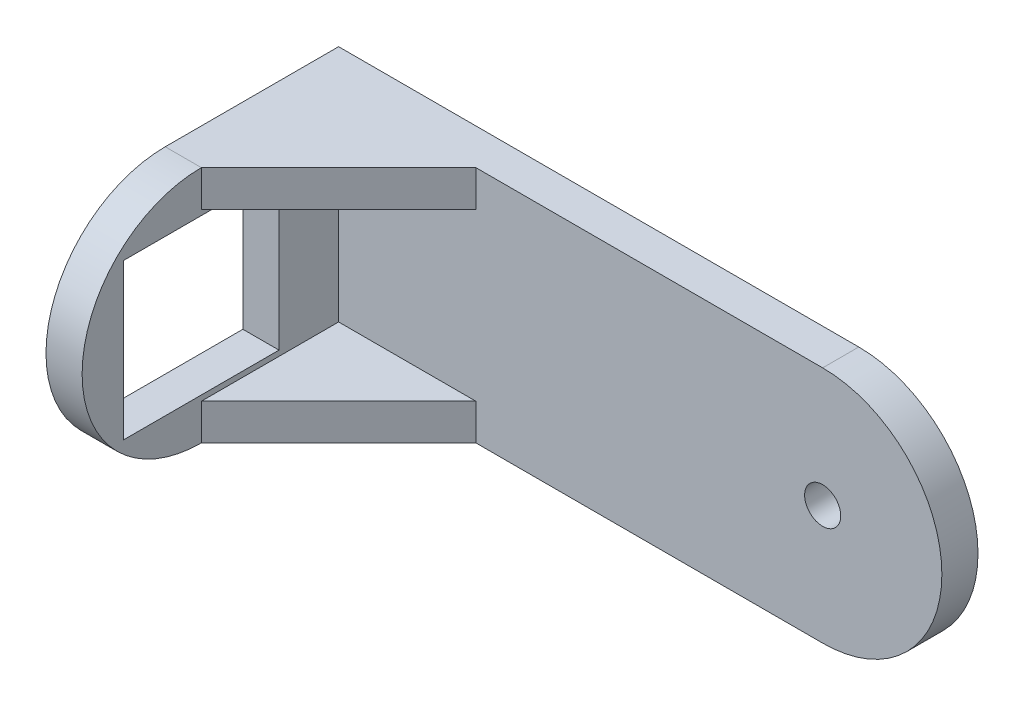
ISO-10303-21;
HEADER;
FILE_DESCRIPTION(('STEP AP214'),'2;1');
FILE_NAME('part.step','',(''),(''),'','','');
FILE_SCHEMA(('AUTOMOTIVE_DESIGN { 1 0 10303 214 1 1 1 1 }'));
ENDSEC;
DATA;
#1=APPLICATION_CONTEXT('core data for automotive mechanical design processes');
#2=APPLICATION_PROTOCOL_DEFINITION('international standard','automotive_design',2000,#1);
#3=PRODUCT_CONTEXT('',#1,'mechanical');
#4=PRODUCT('Part','Part','',(#3));
#5=PRODUCT_RELATED_PRODUCT_CATEGORY('part','',(#4));
#6=PRODUCT_DEFINITION_FORMATION('','',#4);
#7=PRODUCT_DEFINITION_CONTEXT('part definition',#1,'design');
#8=PRODUCT_DEFINITION('design','',#6,#7);
#9=PRODUCT_DEFINITION_SHAPE('','',#8);
#10=(LENGTH_UNIT() NAMED_UNIT(*) SI_UNIT(.MILLI.,.METRE.));
#11=(NAMED_UNIT(*) PLANE_ANGLE_UNIT() SI_UNIT($,.RADIAN.));
#12=(NAMED_UNIT(*) SI_UNIT($,.STERADIAN.) SOLID_ANGLE_UNIT());
#13=UNCERTAINTY_MEASURE_WITH_UNIT(LENGTH_MEASURE(1.E-05),#10,'distance_accuracy_value','');
#14=(GEOMETRIC_REPRESENTATION_CONTEXT(3) GLOBAL_UNCERTAINTY_ASSIGNED_CONTEXT((#13)) GLOBAL_UNIT_ASSIGNED_CONTEXT((#10,
#11,#12)) REPRESENTATION_CONTEXT('',''));
#15=CARTESIAN_POINT('',(0.,0.,0.));
#16=DIRECTION('',(0.,0.,1.));
#17=DIRECTION('',(1.,0.,0.));
#18=AXIS2_PLACEMENT_3D('',#15,#16,#17);
#19=CARTESIAN_POINT('',(0.,0.,10.));
#20=DIRECTION('',(0.,0.,-1.));
#21=DIRECTION('',(-1.,0.,0.));
#22=AXIS2_PLACEMENT_3D('',#19,#20,#21);
#23=PLANE('',#22);
#24=CARTESIAN_POINT('',(0.,0.,10.));
#25=DIRECTION('',(0.,0.,1.));
#26=DIRECTION('',(1.,0.,0.));
#27=AXIS2_PLACEMENT_3D('',#24,#25,#26);
#28=CIRCLE('',#27,5.);
#29=CARTESIAN_POINT('',(5.,0.,10.));
#30=VERTEX_POINT('',#29);
#31=EDGE_CURVE('E228',#30,#30,#28,.T.);
#32=ORIENTED_EDGE('',*,*,#31,.F.);
#33=EDGE_LOOP('',(#32));
#34=FACE_BOUND('',#33,.T.);
#35=DIRECTION('',(0.,-1.,0.));
#36=VECTOR('',#35,1.);
#37=CARTESIAN_POINT('',(-95.9999999999996,-23.,10.));
#38=LINE('',#37,#36);
#39=CARTESIAN_POINT('',(-95.9999999999996,-23.,10.));
#40=VERTEX_POINT('',#39);
#41=CARTESIAN_POINT('',(-95.9999999999996,-33.,10.));
#42=VERTEX_POINT('',#41);
#43=EDGE_CURVE('E284',#40,#42,#38,.T.);
#44=ORIENTED_EDGE('',*,*,#43,.T.);
#45=DIRECTION('',(1.,0.,0.));
#46=VECTOR('',#45,1.);
#47=CARTESIAN_POINT('',(-144.,-33.,10.));
#48=LINE('',#47,#46);
#49=CARTESIAN_POINT('',(0.,-33.,10.));
#50=VERTEX_POINT('',#49);
#51=EDGE_CURVE('E242',#42,#50,#48,.T.);
#52=ORIENTED_EDGE('',*,*,#51,.T.);
#53=CARTESIAN_POINT('',(0.,0.,10.));
#54=DIRECTION('',(0.,0.,1.));
#55=DIRECTION('',(-1.,0.,0.));
#56=AXIS2_PLACEMENT_3D('',#53,#54,#55);
#57=CIRCLE('',#56,33.);
#58=CARTESIAN_POINT('',(0.,33.,10.));
#59=VERTEX_POINT('',#58);
#60=EDGE_CURVE('E236',#50,#59,#57,.T.);
#61=ORIENTED_EDGE('',*,*,#60,.T.);
#62=DIRECTION('',(-1.,0.,0.));
#63=VECTOR('',#62,1.);
#64=CARTESIAN_POINT('',(0.,33.,10.));
#65=LINE('',#64,#63);
#66=CARTESIAN_POINT('',(-95.9999999999996,33.,10.));
#67=VERTEX_POINT('',#66);
#68=EDGE_CURVE('E68',#59,#67,#65,.T.);
#69=ORIENTED_EDGE('',*,*,#68,.T.);
#70=DIRECTION('',(0.,1.,0.));
#71=VECTOR('',#70,1.);
#72=CARTESIAN_POINT('',(-95.9999999999996,23.,10.));
#73=LINE('',#72,#71);
#74=CARTESIAN_POINT('',(-95.9999999999996,23.,10.));
#75=VERTEX_POINT('',#74);
#76=EDGE_CURVE('E63',#75,#67,#73,.T.);
#77=ORIENTED_EDGE('',*,*,#76,.F.);
#78=DIRECTION('',(-1.,0.,0.));
#79=VECTOR('',#78,1.);
#80=CARTESIAN_POINT('',(-134.,23.,10.));
#81=LINE('',#80,#79);
#82=CARTESIAN_POINT('',(-134.,23.,10.));
#83=VERTEX_POINT('',#82);
#84=EDGE_CURVE('E162',#75,#83,#81,.T.);
#85=ORIENTED_EDGE('',*,*,#84,.T.);
#86=DIRECTION('',(0.,1.,0.));
#87=VECTOR('',#86,1.);
#88=CARTESIAN_POINT('',(-134.,0.,10.));
#89=LINE('',#88,#87);
#90=CARTESIAN_POINT('',(-134.,-23.,10.));
#91=VERTEX_POINT('',#90);
#92=EDGE_CURVE('E155',#91,#83,#89,.T.);
#93=ORIENTED_EDGE('',*,*,#92,.F.);
#94=DIRECTION('',(-1.,0.,0.));
#95=VECTOR('',#94,1.);
#96=CARTESIAN_POINT('',(-134.,-23.,10.));
#97=LINE('',#96,#95);
#98=EDGE_CURVE('E142',#40,#91,#97,.T.);
#99=ORIENTED_EDGE('',*,*,#98,.F.);
#100=EDGE_LOOP('',(#44,#52,#61,#69,#77,#85,#93,#99));
#101=FACE_BOUND('',#100,.T.);
#102=ADVANCED_FACE('F47',(#34,#101),#23,.F.);
#103=CARTESIAN_POINT('',(-134.,0.,0.));
#104=DIRECTION('',(-1.,0.,0.));
#105=DIRECTION('',(0.,0.,1.));
#106=AXIS2_PLACEMENT_3D('',#103,#104,#105);
#107=PLANE('',#106);
#108=DIRECTION('',(0.,0.,1.));
#109=VECTOR('',#108,1.);
#110=CARTESIAN_POINT('',(-134.,21.5,0.));
#111=LINE('',#110,#109);
#112=CARTESIAN_POINT('',(-134.,21.5,26.5));
#113=VERTEX_POINT('',#112);
#114=CARTESIAN_POINT('',(-134.,21.5,69.5));
#115=VERTEX_POINT('',#114);
#116=EDGE_CURVE('E165',#113,#115,#111,.T.);
#117=ORIENTED_EDGE('',*,*,#116,.F.);
#118=DIRECTION('',(0.,-1.,0.));
#119=VECTOR('',#118,1.);
#120=CARTESIAN_POINT('',(-134.,0.,26.5));
#121=LINE('',#120,#119);
#122=CARTESIAN_POINT('',(-134.,-21.5,26.5));
#123=VERTEX_POINT('',#122);
#124=EDGE_CURVE('E183',#113,#123,#121,.T.);
#125=ORIENTED_EDGE('',*,*,#124,.T.);
#126=DIRECTION('',(0.,0.,1.));
#127=VECTOR('',#126,1.);
#128=CARTESIAN_POINT('',(-134.,-21.5,0.));
#129=LINE('',#128,#127);
#130=CARTESIAN_POINT('',(-134.,-21.5,69.5));
#131=VERTEX_POINT('',#130);
#132=EDGE_CURVE('E180',#123,#131,#129,.T.);
#133=ORIENTED_EDGE('',*,*,#132,.T.);
#134=DIRECTION('',(0.,-1.,0.));
#135=VECTOR('',#134,1.);
#136=CARTESIAN_POINT('',(-134.,0.,69.5));
#137=LINE('',#136,#135);
#138=EDGE_CURVE('E171',#115,#131,#137,.T.);
#139=ORIENTED_EDGE('',*,*,#138,.F.);
#140=EDGE_LOOP('',(#117,#125,#133,#139));
#141=FACE_BOUND('',#140,.T.);
#142=DIRECTION('',(0.,-1.,0.));
#143=VECTOR('',#142,1.);
#144=CARTESIAN_POINT('',(-134.,-23.,48.));
#145=LINE('',#144,#143);
#146=CARTESIAN_POINT('',(-134.,-23.,48.));
#147=VERTEX_POINT('',#146);
#148=CARTESIAN_POINT('',(-134.,-33.,48.));
#149=VERTEX_POINT('',#148);
#150=EDGE_CURVE('E157',#147,#149,#145,.T.);
#151=ORIENTED_EDGE('',*,*,#150,.F.);
#152=DIRECTION('',(0.,0.,1.));
#153=VECTOR('',#152,1.);
#154=CARTESIAN_POINT('',(-134.,-23.,48.));
#155=LINE('',#154,#153);
#156=EDGE_CURVE('E145',#91,#147,#155,.T.);
#157=ORIENTED_EDGE('',*,*,#156,.F.);
#158=ORIENTED_EDGE('',*,*,#92,.T.);
#159=DIRECTION('',(0.,0.,1.));
#160=VECTOR('',#159,1.);
#161=CARTESIAN_POINT('',(-134.,23.,48.));
#162=LINE('',#161,#160);
#163=CARTESIAN_POINT('',(-134.,23.,48.));
#164=VERTEX_POINT('',#163);
#165=EDGE_CURVE('E301',#83,#164,#162,.T.);
#166=ORIENTED_EDGE('',*,*,#165,.T.);
#167=DIRECTION('',(0.,1.,0.));
#168=VECTOR('',#167,1.);
#169=CARTESIAN_POINT('',(-134.,23.,48.));
#170=LINE('',#169,#168);
#171=CARTESIAN_POINT('',(-134.,33.,48.));
#172=VERTEX_POINT('',#171);
#173=EDGE_CURVE('E292',#164,#172,#170,.T.);
#174=ORIENTED_EDGE('',*,*,#173,.T.);
#175=CARTESIAN_POINT('',(-134.,0.,48.));
#176=DIRECTION('',(-1.,0.,0.));
#177=DIRECTION('',(0.,0.,1.));
#178=AXIS2_PLACEMENT_3D('',#175,#176,#177);
#179=CIRCLE('',#178,33.);
#180=EDGE_CURVE('E166',#172,#149,#179,.F.);
#181=ORIENTED_EDGE('',*,*,#180,.T.);
#182=EDGE_LOOP('',(#151,#157,#158,#166,#174,#181));
#183=FACE_BOUND('',#182,.T.);
#184=ADVANCED_FACE('F154',(#141,#183),#107,.F.);
#185=CARTESIAN_POINT('',(0.,0.,0.));
#186=DIRECTION('',(0.,0.,-1.));
#187=DIRECTION('',(-1.,0.,0.));
#188=AXIS2_PLACEMENT_3D('',#185,#186,#187);
#189=PLANE('',#188);
#190=CARTESIAN_POINT('',(0.,0.,0.));
#191=DIRECTION('',(0.,0.,1.));
#192=DIRECTION('',(-1.,0.,0.));
#193=AXIS2_PLACEMENT_3D('',#190,#191,#192);
#194=CIRCLE('',#193,33.);
#195=CARTESIAN_POINT('',(0.,-33.,0.));
#196=VERTEX_POINT('',#195);
#197=CARTESIAN_POINT('',(0.,33.,0.));
#198=VERTEX_POINT('',#197);
#199=EDGE_CURVE('E232',#196,#198,#194,.T.);
#200=ORIENTED_EDGE('',*,*,#199,.F.);
#201=DIRECTION('',(1.,0.,0.));
#202=VECTOR('',#201,1.);
#203=CARTESIAN_POINT('',(-144.,-33.,0.));
#204=LINE('',#203,#202);
#205=CARTESIAN_POINT('',(-144.,-33.,0.));
#206=VERTEX_POINT('',#205);
#207=EDGE_CURVE('E239',#206,#196,#204,.T.);
#208=ORIENTED_EDGE('',*,*,#207,.F.);
#209=DIRECTION('',(0.,-1.,0.));
#210=VECTOR('',#209,1.);
#211=CARTESIAN_POINT('',(-144.,33.,0.));
#212=LINE('',#211,#210);
#213=CARTESIAN_POINT('',(-144.,33.,0.));
#214=VERTEX_POINT('',#213);
#215=EDGE_CURVE('E252',#214,#206,#212,.T.);
#216=ORIENTED_EDGE('',*,*,#215,.F.);
#217=DIRECTION('',(-1.,0.,0.));
#218=VECTOR('',#217,1.);
#219=CARTESIAN_POINT('',(0.,33.,0.));
#220=LINE('',#219,#218);
#221=EDGE_CURVE('E249',#198,#214,#220,.T.);
#222=ORIENTED_EDGE('',*,*,#221,.F.);
#223=EDGE_LOOP('',(#200,#208,#216,#222));
#224=FACE_BOUND('',#223,.T.);
#225=CARTESIAN_POINT('',(0.,0.,0.));
#226=DIRECTION('',(0.,0.,1.));
#227=DIRECTION('',(1.,0.,0.));
#228=AXIS2_PLACEMENT_3D('',#225,#226,#227);
#229=CIRCLE('',#228,5.);
#230=CARTESIAN_POINT('',(5.,0.,0.));
#231=VERTEX_POINT('',#230);
#232=EDGE_CURVE('E210',#231,#231,#229,.T.);
#233=ORIENTED_EDGE('',*,*,#232,.T.);
#234=EDGE_LOOP('',(#233));
#235=FACE_BOUND('',#234,.T.);
#236=ADVANCED_FACE('F275',(#224,#235),#189,.T.);
#237=CARTESIAN_POINT('',(0.,0.,10.));
#238=DIRECTION('',(0.,0.,-1.));
#239=DIRECTION('',(-1.,0.,0.));
#240=AXIS2_PLACEMENT_3D('',#237,#238,#239);
#241=CYLINDRICAL_SURFACE('',#240,33.);
#242=ORIENTED_EDGE('',*,*,#199,.T.);
#243=DIRECTION('',(0.,0.,-1.));
#244=VECTOR('',#243,1.);
#245=CARTESIAN_POINT('',(0.,33.,10.));
#246=LINE('',#245,#244);
#247=EDGE_CURVE('E11',#59,#198,#246,.T.);
#248=ORIENTED_EDGE('',*,*,#247,.F.);
#249=ORIENTED_EDGE('',*,*,#60,.F.);
#250=DIRECTION('',(0.,0.,-1.));
#251=VECTOR('',#250,1.);
#252=CARTESIAN_POINT('',(0.,-33.,10.));
#253=LINE('',#252,#251);
#254=EDGE_CURVE('E245',#50,#196,#253,.T.);
#255=ORIENTED_EDGE('',*,*,#254,.T.);
#256=EDGE_LOOP('',(#242,#248,#249,#255));
#257=FACE_BOUND('',#256,.T.);
#258=ADVANCED_FACE('F49',(#257),#241,.T.);
#259=CARTESIAN_POINT('',(0.,33.,10.));
#260=DIRECTION('',(0.,-1.,0.));
#261=DIRECTION('',(1.,0.,0.));
#262=AXIS2_PLACEMENT_3D('',#259,#260,#261);
#263=PLANE('',#262);
#264=ORIENTED_EDGE('',*,*,#221,.T.);
#265=DIRECTION('',(0.,0.,-1.));
#266=VECTOR('',#265,1.);
#267=CARTESIAN_POINT('',(-144.,33.,10.));
#268=LINE('',#267,#266);
#269=CARTESIAN_POINT('',(-144.,33.,48.));
#270=VERTEX_POINT('',#269);
#271=EDGE_CURVE('E56',#270,#214,#268,.T.);
#272=ORIENTED_EDGE('',*,*,#271,.F.);
#273=DIRECTION('',(-1.,0.,0.));
#274=VECTOR('',#273,1.);
#275=CARTESIAN_POINT('',(-134.,33.,48.));
#276=LINE('',#275,#274);
#277=EDGE_CURVE('E187',#172,#270,#276,.T.);
#278=ORIENTED_EDGE('',*,*,#277,.F.);
#279=DIRECTION('',(0.707106781186551,0.,-0.707106781186544));
#280=VECTOR('',#279,1.);
#281=CARTESIAN_POINT('',(-134.,33.,48.));
#282=LINE('',#281,#280);
#283=EDGE_CURVE('E298',#172,#67,#282,.T.);
#284=ORIENTED_EDGE('',*,*,#283,.T.);
#285=ORIENTED_EDGE('',*,*,#68,.F.);
#286=ORIENTED_EDGE('',*,*,#247,.T.);
#287=EDGE_LOOP('',(#264,#272,#278,#284,#285,#286));
#288=FACE_BOUND('',#287,.T.);
#289=ADVANCED_FACE('F297',(#288),#263,.F.);
#290=CARTESIAN_POINT('',(-144.,33.,10.));
#291=DIRECTION('',(1.,0.,0.));
#292=DIRECTION('',(0.,0.,-1.));
#293=AXIS2_PLACEMENT_3D('',#290,#291,#292);
#294=PLANE('',#293);
#295=ORIENTED_EDGE('',*,*,#215,.T.);
#296=DIRECTION('',(0.,0.,-1.));
#297=VECTOR('',#296,1.);
#298=CARTESIAN_POINT('',(-144.,-33.,10.));
#299=LINE('',#298,#297);
#300=CARTESIAN_POINT('',(-144.,-33.,48.));
#301=VERTEX_POINT('',#300);
#302=EDGE_CURVE('E260',#301,#206,#299,.T.);
#303=ORIENTED_EDGE('',*,*,#302,.F.);
#304=CARTESIAN_POINT('',(-144.,0.,48.));
#305=DIRECTION('',(-1.,0.,0.));
#306=DIRECTION('',(0.,0.,1.));
#307=AXIS2_PLACEMENT_3D('',#304,#305,#306);
#308=CIRCLE('',#307,33.);
#309=EDGE_CURVE('E188',#270,#301,#308,.F.);
#310=ORIENTED_EDGE('',*,*,#309,.F.);
#311=ORIENTED_EDGE('',*,*,#271,.T.);
#312=EDGE_LOOP('',(#295,#303,#310,#311));
#313=FACE_BOUND('',#312,.T.);
#314=DIRECTION('',(0.,0.,1.));
#315=VECTOR('',#314,1.);
#316=CARTESIAN_POINT('',(-144.,21.5,0.));
#317=LINE('',#316,#315);
#318=CARTESIAN_POINT('',(-144.,21.5,26.5));
#319=VERTEX_POINT('',#318);
#320=CARTESIAN_POINT('',(-144.,21.5,69.5));
#321=VERTEX_POINT('',#320);
#322=EDGE_CURVE('E192',#319,#321,#317,.T.);
#323=ORIENTED_EDGE('',*,*,#322,.T.);
#324=DIRECTION('',(0.,-1.,0.));
#325=VECTOR('',#324,1.);
#326=CARTESIAN_POINT('',(-144.,0.,69.5));
#327=LINE('',#326,#325);
#328=CARTESIAN_POINT('',(-144.,-21.5,69.5));
#329=VERTEX_POINT('',#328);
#330=EDGE_CURVE('E196',#321,#329,#327,.T.);
#331=ORIENTED_EDGE('',*,*,#330,.T.);
#332=DIRECTION('',(0.,0.,1.));
#333=VECTOR('',#332,1.);
#334=CARTESIAN_POINT('',(-144.,-21.5,0.));
#335=LINE('',#334,#333);
#336=CARTESIAN_POINT('',(-144.,-21.5,26.5));
#337=VERTEX_POINT('',#336);
#338=EDGE_CURVE('E200',#337,#329,#335,.T.);
#339=ORIENTED_EDGE('',*,*,#338,.F.);
#340=DIRECTION('',(0.,-1.,0.));
#341=VECTOR('',#340,1.);
#342=CARTESIAN_POINT('',(-144.,0.,26.5));
#343=LINE('',#342,#341);
#344=EDGE_CURVE('E173',#319,#337,#343,.T.);
#345=ORIENTED_EDGE('',*,*,#344,.F.);
#346=EDGE_LOOP('',(#323,#331,#339,#345));
#347=FACE_BOUND('',#346,.T.);
#348=ADVANCED_FACE('F268',(#313,#347),#294,.F.);
#349=CARTESIAN_POINT('',(-144.,-33.,10.));
#350=DIRECTION('',(0.,1.,0.));
#351=DIRECTION('',(-1.,0.,0.));
#352=AXIS2_PLACEMENT_3D('',#349,#350,#351);
#353=PLANE('',#352);
#354=ORIENTED_EDGE('',*,*,#51,.F.);
#355=DIRECTION('',(0.707106781186551,0.,-0.707106781186544));
#356=VECTOR('',#355,1.);
#357=CARTESIAN_POINT('',(-134.,-33.,48.));
#358=LINE('',#357,#356);
#359=EDGE_CURVE('E159',#149,#42,#358,.T.);
#360=ORIENTED_EDGE('',*,*,#359,.F.);
#361=DIRECTION('',(-1.,0.,0.));
#362=VECTOR('',#361,1.);
#363=CARTESIAN_POINT('',(-134.,-33.,48.));
#364=LINE('',#363,#362);
#365=EDGE_CURVE('E221',#149,#301,#364,.T.);
#366=ORIENTED_EDGE('',*,*,#365,.T.);
#367=ORIENTED_EDGE('',*,*,#302,.T.);
#368=ORIENTED_EDGE('',*,*,#207,.T.);
#369=ORIENTED_EDGE('',*,*,#254,.F.);
#370=EDGE_LOOP('',(#354,#360,#366,#367,#368,#369));
#371=FACE_BOUND('',#370,.T.);
#372=ADVANCED_FACE('F280',(#371),#353,.F.);
#373=CARTESIAN_POINT('',(0.,0.,10.));
#374=DIRECTION('',(0.,0.,-1.));
#375=DIRECTION('',(-1.,0.,0.));
#376=AXIS2_PLACEMENT_3D('',#373,#374,#375);
#377=CYLINDRICAL_SURFACE('',#376,5.);
#378=ORIENTED_EDGE('',*,*,#31,.T.);
#379=EDGE_LOOP('',(#378));
#380=FACE_BOUND('',#379,.T.);
#381=ORIENTED_EDGE('',*,*,#232,.F.);
#382=EDGE_LOOP('',(#381));
#383=FACE_BOUND('',#382,.T.);
#384=ADVANCED_FACE('F344',(#380,#383),#377,.F.);
#385=CARTESIAN_POINT('',(-134.,21.5,0.));
#386=DIRECTION('',(0.,-1.,0.));
#387=DIRECTION('',(0.,0.,-1.));
#388=AXIS2_PLACEMENT_3D('',#385,#386,#387);
#389=PLANE('',#388);
#390=ORIENTED_EDGE('',*,*,#322,.F.);
#391=DIRECTION('',(-1.,0.,0.));
#392=VECTOR('',#391,1.);
#393=CARTESIAN_POINT('',(-134.,21.5,26.5));
#394=LINE('',#393,#392);
#395=EDGE_CURVE('E207',#113,#319,#394,.T.);
#396=ORIENTED_EDGE('',*,*,#395,.F.);
#397=ORIENTED_EDGE('',*,*,#116,.T.);
#398=DIRECTION('',(-1.,0.,0.));
#399=VECTOR('',#398,1.);
#400=CARTESIAN_POINT('',(-134.,21.5,69.5));
#401=LINE('',#400,#399);
#402=EDGE_CURVE('E218',#115,#321,#401,.T.);
#403=ORIENTED_EDGE('',*,*,#402,.T.);
#404=EDGE_LOOP('',(#390,#396,#397,#403));
#405=FACE_BOUND('',#404,.T.);
#406=ADVANCED_FACE('F367',(#405),#389,.T.);
#407=CARTESIAN_POINT('',(-134.,0.,26.5));
#408=DIRECTION('',(0.,0.,-1.));
#409=DIRECTION('',(-1.,0.,0.));
#410=AXIS2_PLACEMENT_3D('',#407,#408,#409);
#411=PLANE('',#410);
#412=ORIENTED_EDGE('',*,*,#344,.T.);
#413=DIRECTION('',(-1.,0.,0.));
#414=VECTOR('',#413,1.);
#415=CARTESIAN_POINT('',(-134.,-21.5,26.5));
#416=LINE('',#415,#414);
#417=EDGE_CURVE('E211',#123,#337,#416,.T.);
#418=ORIENTED_EDGE('',*,*,#417,.F.);
#419=ORIENTED_EDGE('',*,*,#124,.F.);
#420=ORIENTED_EDGE('',*,*,#395,.T.);
#421=EDGE_LOOP('',(#412,#418,#419,#420));
#422=FACE_BOUND('',#421,.T.);
#423=ADVANCED_FACE('F384',(#422),#411,.F.);
#424=CARTESIAN_POINT('',(-134.,-21.5,0.));
#425=DIRECTION('',(0.,-1.,0.));
#426=DIRECTION('',(0.,0.,-1.));
#427=AXIS2_PLACEMENT_3D('',#424,#425,#426);
#428=PLANE('',#427);
#429=ORIENTED_EDGE('',*,*,#338,.T.);
#430=DIRECTION('',(-1.,0.,0.));
#431=VECTOR('',#430,1.);
#432=CARTESIAN_POINT('',(-134.,-21.5,69.5));
#433=LINE('',#432,#431);
#434=EDGE_CURVE('E215',#131,#329,#433,.T.);
#435=ORIENTED_EDGE('',*,*,#434,.F.);
#436=ORIENTED_EDGE('',*,*,#132,.F.);
#437=ORIENTED_EDGE('',*,*,#417,.T.);
#438=EDGE_LOOP('',(#429,#435,#436,#437));
#439=FACE_BOUND('',#438,.T.);
#440=ADVANCED_FACE('F393',(#439),#428,.F.);
#441=CARTESIAN_POINT('',(-134.,0.,48.));
#442=DIRECTION('',(-1.,0.,0.));
#443=DIRECTION('',(0.,0.,1.));
#444=AXIS2_PLACEMENT_3D('',#441,#442,#443);
#445=CYLINDRICAL_SURFACE('',#444,33.);
#446=ORIENTED_EDGE('',*,*,#309,.T.);
#447=ORIENTED_EDGE('',*,*,#365,.F.);
#448=ORIENTED_EDGE('',*,*,#180,.F.);
#449=ORIENTED_EDGE('',*,*,#277,.T.);
#450=EDGE_LOOP('',(#446,#447,#448,#449));
#451=FACE_BOUND('',#450,.T.);
#452=ADVANCED_FACE('F295',(#451),#445,.T.);
#453=CARTESIAN_POINT('',(-134.,0.,69.5));
#454=DIRECTION('',(0.,0.,-1.));
#455=DIRECTION('',(-1.,0.,0.));
#456=AXIS2_PLACEMENT_3D('',#453,#454,#455);
#457=PLANE('',#456);
#458=ORIENTED_EDGE('',*,*,#330,.F.);
#459=ORIENTED_EDGE('',*,*,#402,.F.);
#460=ORIENTED_EDGE('',*,*,#138,.T.);
#461=ORIENTED_EDGE('',*,*,#434,.T.);
#462=EDGE_LOOP('',(#458,#459,#460,#461));
#463=FACE_BOUND('',#462,.T.);
#464=ADVANCED_FACE('F332',(#463),#457,.T.);
#465=CARTESIAN_POINT('',(-134.,23.,48.));
#466=DIRECTION('',(0.707106781186544,0.,0.707106781186551));
#467=DIRECTION('',(0.707106781186551,0.,-0.707106781186544));
#468=AXIS2_PLACEMENT_3D('',#465,#466,#467);
#469=PLANE('',#468);
#470=ORIENTED_EDGE('',*,*,#283,.F.);
#471=ORIENTED_EDGE('',*,*,#173,.F.);
#472=DIRECTION('',(0.707106781186551,0.,-0.707106781186544));
#473=VECTOR('',#472,1.);
#474=CARTESIAN_POINT('',(-134.,23.,48.));
#475=LINE('',#474,#473);
#476=EDGE_CURVE('E305',#164,#75,#475,.T.);
#477=ORIENTED_EDGE('',*,*,#476,.T.);
#478=ORIENTED_EDGE('',*,*,#76,.T.);
#479=EDGE_LOOP('',(#470,#471,#477,#478));
#480=FACE_BOUND('',#479,.T.);
#481=ADVANCED_FACE('F320',(#480),#469,.T.);
#482=CARTESIAN_POINT('',(0.,23.,0.));
#483=DIRECTION('',(0.,-1.,0.));
#484=DIRECTION('',(1.,0.,0.));
#485=AXIS2_PLACEMENT_3D('',#482,#483,#484);
#486=PLANE('',#485);
#487=ORIENTED_EDGE('',*,*,#165,.F.);
#488=ORIENTED_EDGE('',*,*,#84,.F.);
#489=ORIENTED_EDGE('',*,*,#476,.F.);
#490=EDGE_LOOP('',(#487,#488,#489));
#491=FACE_BOUND('',#490,.T.);
#492=ADVANCED_FACE('F322',(#491),#486,.T.);
#493=CARTESIAN_POINT('',(-134.,-23.,48.));
#494=DIRECTION('',(-0.707106781186544,0.,-0.707106781186551));
#495=DIRECTION('',(-0.707106781186551,0.,0.707106781186544));
#496=AXIS2_PLACEMENT_3D('',#493,#494,#495);
#497=PLANE('',#496);
#498=ORIENTED_EDGE('',*,*,#359,.T.);
#499=ORIENTED_EDGE('',*,*,#43,.F.);
#500=DIRECTION('',(0.707106781186551,0.,-0.707106781186544));
#501=VECTOR('',#500,1.);
#502=CARTESIAN_POINT('',(-134.,-23.,48.));
#503=LINE('',#502,#501);
#504=EDGE_CURVE('E147',#147,#40,#503,.T.);
#505=ORIENTED_EDGE('',*,*,#504,.F.);
#506=ORIENTED_EDGE('',*,*,#150,.T.);
#507=EDGE_LOOP('',(#498,#499,#505,#506));
#508=FACE_BOUND('',#507,.T.);
#509=ADVANCED_FACE('F324',(#508),#497,.F.);
#510=CARTESIAN_POINT('',(0.,-23.,0.));
#511=DIRECTION('',(0.,1.,0.));
#512=DIRECTION('',(1.,0.,0.));
#513=AXIS2_PLACEMENT_3D('',#510,#511,#512);
#514=PLANE('',#513);
#515=ORIENTED_EDGE('',*,*,#156,.T.);
#516=ORIENTED_EDGE('',*,*,#504,.T.);
#517=ORIENTED_EDGE('',*,*,#98,.T.);
#518=EDGE_LOOP('',(#515,#516,#517));
#519=FACE_BOUND('',#518,.T.);
#520=ADVANCED_FACE('F144',(#519),#514,.T.);
#521=CLOSED_SHELL('',(#102,#184,#236,#258,#289,#348,#372,#384,#406,#423,#440,#452,#464,#481,
#492,#509,#520));
#522=MANIFOLD_SOLID_BREP('B2',#521);
#523=ADVANCED_BREP_SHAPE_REPRESENTATION('',(#18,#522),#14);
#524=SHAPE_DEFINITION_REPRESENTATION(#9,#523);
ENDSEC;
END-ISO-10303-21;
